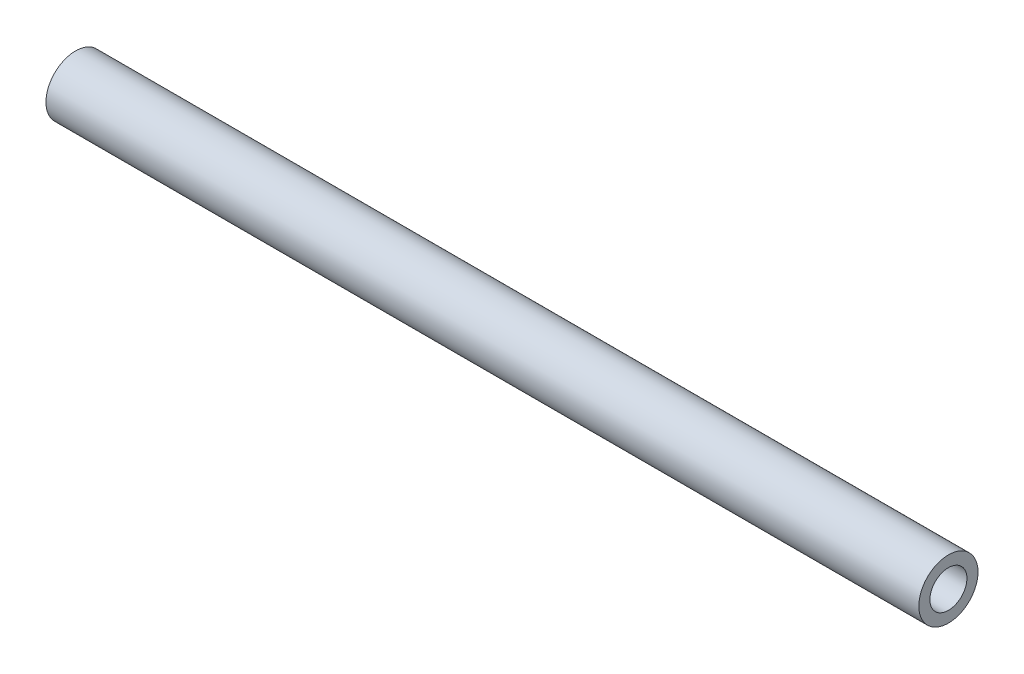
ISO-10303-21;
HEADER;
FILE_DESCRIPTION(('STEP AP214'),'2;1');
FILE_NAME('part.step','',(''),(''),'','','');
FILE_SCHEMA(('AUTOMOTIVE_DESIGN { 1 0 10303 214 1 1 1 1 }'));
ENDSEC;
DATA;
#1=APPLICATION_CONTEXT('core data for automotive mechanical design processes');
#2=APPLICATION_PROTOCOL_DEFINITION('international standard','automotive_design',2000,#1);
#3=PRODUCT_CONTEXT('',#1,'mechanical');
#4=PRODUCT('Part','Part','',(#3));
#5=PRODUCT_RELATED_PRODUCT_CATEGORY('part','',(#4));
#6=PRODUCT_DEFINITION_FORMATION('','',#4);
#7=PRODUCT_DEFINITION_CONTEXT('part definition',#1,'design');
#8=PRODUCT_DEFINITION('design','',#6,#7);
#9=PRODUCT_DEFINITION_SHAPE('','',#8);
#10=(LENGTH_UNIT() NAMED_UNIT(*) SI_UNIT(.MILLI.,.METRE.));
#11=(NAMED_UNIT(*) PLANE_ANGLE_UNIT() SI_UNIT($,.RADIAN.));
#12=(NAMED_UNIT(*) SI_UNIT($,.STERADIAN.) SOLID_ANGLE_UNIT());
#13=UNCERTAINTY_MEASURE_WITH_UNIT(LENGTH_MEASURE(1.E-05),#10,'distance_accuracy_value','');
#14=(GEOMETRIC_REPRESENTATION_CONTEXT(3) GLOBAL_UNCERTAINTY_ASSIGNED_CONTEXT((#13)) GLOBAL_UNIT_ASSIGNED_CONTEXT((#10,
#11,#12)) REPRESENTATION_CONTEXT('',''));
#15=CARTESIAN_POINT('',(0.,0.,0.));
#16=DIRECTION('',(0.,0.,1.));
#17=DIRECTION('',(1.,0.,0.));
#18=AXIS2_PLACEMENT_3D('',#15,#16,#17);
#19=CARTESIAN_POINT('',(118.,0.,0.));
#20=DIRECTION('',(1.,0.,0.));
#21=DIRECTION('',(0.,0.,-1.));
#22=AXIS2_PLACEMENT_3D('',#19,#20,#21);
#23=PLANE('',#22);
#24=CARTESIAN_POINT('',(118.,0.,0.));
#25=DIRECTION('',(1.,0.,0.));
#26=DIRECTION('',(0.,0.,-1.));
#27=AXIS2_PLACEMENT_3D('',#24,#25,#26);
#28=CIRCLE('',#27,4.);
#29=CARTESIAN_POINT('',(118.,0.,-4.));
#30=VERTEX_POINT('',#29);
#31=EDGE_CURVE('E11',#30,#30,#28,.T.);
#32=ORIENTED_EDGE('',*,*,#31,.T.);
#33=EDGE_LOOP('',(#32));
#34=FACE_BOUND('',#33,.T.);
#35=CARTESIAN_POINT('',(118.,0.,0.));
#36=DIRECTION('',(1.,0.,0.));
#37=DIRECTION('',(0.,0.,-1.));
#38=AXIS2_PLACEMENT_3D('',#35,#36,#37);
#39=CIRCLE('',#38,2.5);
#40=CARTESIAN_POINT('',(118.,0.,-2.5));
#41=VERTEX_POINT('',#40);
#42=EDGE_CURVE('E60',#41,#41,#39,.T.);
#43=ORIENTED_EDGE('',*,*,#42,.F.);
#44=EDGE_LOOP('',(#43));
#45=FACE_BOUND('',#44,.T.);
#46=ADVANCED_FACE('F43',(#34,#45),#23,.T.);
#47=CARTESIAN_POINT('',(0.,0.,0.));
#48=DIRECTION('',(1.,0.,0.));
#49=DIRECTION('',(0.,0.,-1.));
#50=AXIS2_PLACEMENT_3D('',#47,#48,#49);
#51=PLANE('',#50);
#52=CARTESIAN_POINT('',(0.,0.,0.));
#53=DIRECTION('',(1.,0.,0.));
#54=DIRECTION('',(0.,0.,-1.));
#55=AXIS2_PLACEMENT_3D('',#52,#53,#54);
#56=CIRCLE('',#55,4.);
#57=CARTESIAN_POINT('',(0.,0.,-4.));
#58=VERTEX_POINT('',#57);
#59=EDGE_CURVE('E50',#58,#58,#56,.T.);
#60=ORIENTED_EDGE('',*,*,#59,.F.);
#61=EDGE_LOOP('',(#60));
#62=FACE_BOUND('',#61,.T.);
#63=CARTESIAN_POINT('',(0.,0.,0.));
#64=DIRECTION('',(1.,0.,0.));
#65=DIRECTION('',(0.,0.,-1.));
#66=AXIS2_PLACEMENT_3D('',#63,#64,#65);
#67=CIRCLE('',#66,2.5);
#68=CARTESIAN_POINT('',(0.,0.,-2.5));
#69=VERTEX_POINT('',#68);
#70=EDGE_CURVE('E56',#69,#69,#67,.T.);
#71=ORIENTED_EDGE('',*,*,#70,.T.);
#72=EDGE_LOOP('',(#71));
#73=FACE_BOUND('',#72,.T.);
#74=ADVANCED_FACE('F72',(#62,#73),#51,.F.);
#75=CARTESIAN_POINT('',(118.,0.,0.));
#76=DIRECTION('',(-1.,0.,0.));
#77=DIRECTION('',(0.,0.,1.));
#78=AXIS2_PLACEMENT_3D('',#75,#76,#77);
#79=CYLINDRICAL_SURFACE('',#78,4.);
#80=ORIENTED_EDGE('',*,*,#31,.F.);
#81=EDGE_LOOP('',(#80));
#82=FACE_BOUND('',#81,.T.);
#83=ORIENTED_EDGE('',*,*,#59,.T.);
#84=EDGE_LOOP('',(#83));
#85=FACE_BOUND('',#84,.T.);
#86=ADVANCED_FACE('F44',(#82,#85),#79,.T.);
#87=CARTESIAN_POINT('',(118.,0.,0.));
#88=DIRECTION('',(-1.,0.,0.));
#89=DIRECTION('',(0.,0.,1.));
#90=AXIS2_PLACEMENT_3D('',#87,#88,#89);
#91=CYLINDRICAL_SURFACE('',#90,2.5);
#92=ORIENTED_EDGE('',*,*,#42,.T.);
#93=EDGE_LOOP('',(#92));
#94=FACE_BOUND('',#93,.T.);
#95=ORIENTED_EDGE('',*,*,#70,.F.);
#96=EDGE_LOOP('',(#95));
#97=FACE_BOUND('',#96,.T.);
#98=ADVANCED_FACE('F66',(#94,#97),#91,.F.);
#99=CLOSED_SHELL('',(#46,#74,#86,#98));
#100=MANIFOLD_SOLID_BREP('B2',#99);
#101=ADVANCED_BREP_SHAPE_REPRESENTATION('',(#18,#100),#14);
#102=SHAPE_DEFINITION_REPRESENTATION(#9,#101);
ENDSEC;
END-ISO-10303-21;
